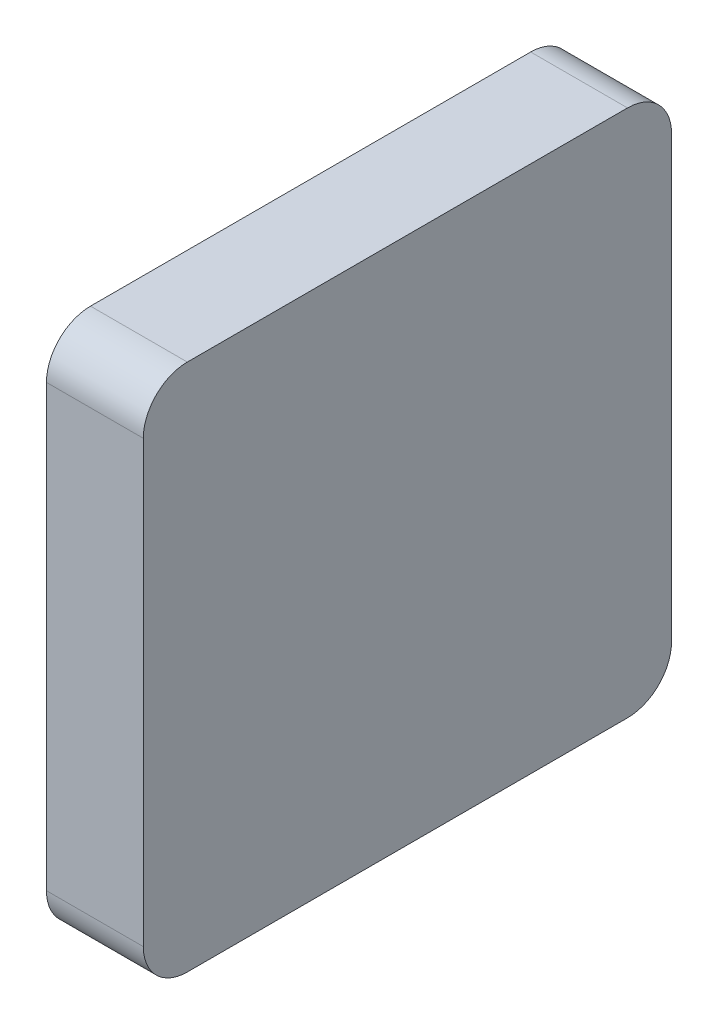
ISO-10303-21;
HEADER;
FILE_DESCRIPTION(('STEP AP214'),'2;1');
FILE_NAME('part.step','',(''),(''),'','','');
FILE_SCHEMA(('AUTOMOTIVE_DESIGN { 1 0 10303 214 1 1 1 1 }'));
ENDSEC;
DATA;
#1=APPLICATION_CONTEXT('core data for automotive mechanical design processes');
#2=APPLICATION_PROTOCOL_DEFINITION('international standard','automotive_design',2000,#1);
#3=PRODUCT_CONTEXT('',#1,'mechanical');
#4=PRODUCT('Part','Part','',(#3));
#5=PRODUCT_RELATED_PRODUCT_CATEGORY('part','',(#4));
#6=PRODUCT_DEFINITION_FORMATION('','',#4);
#7=PRODUCT_DEFINITION_CONTEXT('part definition',#1,'design');
#8=PRODUCT_DEFINITION('design','',#6,#7);
#9=PRODUCT_DEFINITION_SHAPE('','',#8);
#10=(LENGTH_UNIT() NAMED_UNIT(*) SI_UNIT(.MILLI.,.METRE.));
#11=(NAMED_UNIT(*) PLANE_ANGLE_UNIT() SI_UNIT($,.RADIAN.));
#12=(NAMED_UNIT(*) SI_UNIT($,.STERADIAN.) SOLID_ANGLE_UNIT());
#13=UNCERTAINTY_MEASURE_WITH_UNIT(LENGTH_MEASURE(1.E-05),#10,'distance_accuracy_value','');
#14=(GEOMETRIC_REPRESENTATION_CONTEXT(3) GLOBAL_UNCERTAINTY_ASSIGNED_CONTEXT((#13)) GLOBAL_UNIT_ASSIGNED_CONTEXT((#10,
#11,#12)) REPRESENTATION_CONTEXT('',''));
#15=CARTESIAN_POINT('',(0.,0.,0.));
#16=DIRECTION('',(0.,0.,1.));
#17=DIRECTION('',(1.,0.,0.));
#18=AXIS2_PLACEMENT_3D('',#15,#16,#17);
#19=CARTESIAN_POINT('',(22.,60.,60.));
#20=DIRECTION('',(0.,0.,-1.));
#21=DIRECTION('',(0.,1.,0.));
#22=AXIS2_PLACEMENT_3D('',#19,#20,#21);
#23=PLANE('',#22);
#24=DIRECTION('',(0.,-1.,0.));
#25=VECTOR('',#24,1.);
#26=CARTESIAN_POINT('',(0.,60.,60.));
#27=LINE('',#26,#25);
#28=CARTESIAN_POINT('',(0.,50.,60.));
#29=VERTEX_POINT('',#28);
#30=CARTESIAN_POINT('',(0.,-50.,60.));
#31=VERTEX_POINT('',#30);
#32=EDGE_CURVE('E148',#29,#31,#27,.T.);
#33=ORIENTED_EDGE('',*,*,#32,.T.);
#34=DIRECTION('',(-1.,0.,0.));
#35=VECTOR('',#34,1.);
#36=CARTESIAN_POINT('',(22.,-50.,60.));
#37=LINE('',#36,#35);
#38=CARTESIAN_POINT('',(22.,-50.,60.));
#39=VERTEX_POINT('',#38);
#40=EDGE_CURVE('E181',#31,#39,#37,.F.);
#41=ORIENTED_EDGE('',*,*,#40,.T.);
#42=DIRECTION('',(0.,-1.,0.));
#43=VECTOR('',#42,1.);
#44=CARTESIAN_POINT('',(22.,60.,60.));
#45=LINE('',#44,#43);
#46=CARTESIAN_POINT('',(22.,50.,60.));
#47=VERTEX_POINT('',#46);
#48=EDGE_CURVE('E146',#47,#39,#45,.T.);
#49=ORIENTED_EDGE('',*,*,#48,.F.);
#50=DIRECTION('',(-1.,0.,0.));
#51=VECTOR('',#50,1.);
#52=CARTESIAN_POINT('',(22.,50.,60.));
#53=LINE('',#52,#51);
#54=EDGE_CURVE('E177',#47,#29,#53,.T.);
#55=ORIENTED_EDGE('',*,*,#54,.T.);
#56=EDGE_LOOP('',(#33,#41,#49,#55));
#57=FACE_BOUND('',#56,.T.);
#58=ADVANCED_FACE('F45',(#57),#23,.F.);
#59=CARTESIAN_POINT('',(22.,-60.,60.));
#60=DIRECTION('',(0.,1.,0.));
#61=DIRECTION('',(0.,0.,1.));
#62=AXIS2_PLACEMENT_3D('',#59,#60,#61);
#63=PLANE('',#62);
#64=DIRECTION('',(0.,0.,-1.));
#65=VECTOR('',#64,1.);
#66=CARTESIAN_POINT('',(0.,-60.,60.));
#67=LINE('',#66,#65);
#68=CARTESIAN_POINT('',(0.,-60.,50.));
#69=VERTEX_POINT('',#68);
#70=CARTESIAN_POINT('',(0.,-60.,-50.));
#71=VERTEX_POINT('',#70);
#72=EDGE_CURVE('E142',#69,#71,#67,.T.);
#73=ORIENTED_EDGE('',*,*,#72,.T.);
#74=DIRECTION('',(-1.,0.,0.));
#75=VECTOR('',#74,1.);
#76=CARTESIAN_POINT('',(22.,-60.,-50.));
#77=LINE('',#76,#75);
#78=CARTESIAN_POINT('',(22.,-60.,-50.));
#79=VERTEX_POINT('',#78);
#80=EDGE_CURVE('E117',#71,#79,#77,.F.);
#81=ORIENTED_EDGE('',*,*,#80,.T.);
#82=DIRECTION('',(0.,0.,-1.));
#83=VECTOR('',#82,1.);
#84=CARTESIAN_POINT('',(22.,-60.,60.));
#85=LINE('',#84,#83);
#86=CARTESIAN_POINT('',(22.,-60.,50.));
#87=VERTEX_POINT('',#86);
#88=EDGE_CURVE('E188',#87,#79,#85,.T.);
#89=ORIENTED_EDGE('',*,*,#88,.F.);
#90=DIRECTION('',(-1.,0.,0.));
#91=VECTOR('',#90,1.);
#92=CARTESIAN_POINT('',(22.,-60.,50.));
#93=LINE('',#92,#91);
#94=EDGE_CURVE('E123',#87,#69,#93,.T.);
#95=ORIENTED_EDGE('',*,*,#94,.T.);
#96=EDGE_LOOP('',(#73,#81,#89,#95));
#97=FACE_BOUND('',#96,.T.);
#98=ADVANCED_FACE('F209',(#97),#63,.F.);
#99=CARTESIAN_POINT('',(22.,60.,-60.));
#100=DIRECTION('',(0.,0.,1.));
#101=DIRECTION('',(0.,-1.,0.));
#102=AXIS2_PLACEMENT_3D('',#99,#100,#101);
#103=PLANE('',#102);
#104=DIRECTION('',(0.,1.,0.));
#105=VECTOR('',#104,1.);
#106=CARTESIAN_POINT('',(22.,60.,-60.));
#107=LINE('',#106,#105);
#108=CARTESIAN_POINT('',(22.,-50.,-60.));
#109=VERTEX_POINT('',#108);
#110=CARTESIAN_POINT('',(22.,50.,-60.));
#111=VERTEX_POINT('',#110);
#112=EDGE_CURVE('E132',#109,#111,#107,.T.);
#113=ORIENTED_EDGE('',*,*,#112,.F.);
#114=DIRECTION('',(-1.,0.,0.));
#115=VECTOR('',#114,1.);
#116=CARTESIAN_POINT('',(22.,-50.,-60.));
#117=LINE('',#116,#115);
#118=CARTESIAN_POINT('',(0.,-50.,-60.));
#119=VERTEX_POINT('',#118);
#120=EDGE_CURVE('E116',#109,#119,#117,.T.);
#121=ORIENTED_EDGE('',*,*,#120,.T.);
#122=DIRECTION('',(0.,1.,0.));
#123=VECTOR('',#122,1.);
#124=CARTESIAN_POINT('',(0.,60.,-60.));
#125=LINE('',#124,#123);
#126=CARTESIAN_POINT('',(0.,50.,-60.));
#127=VERTEX_POINT('',#126);
#128=EDGE_CURVE('E130',#119,#127,#125,.T.);
#129=ORIENTED_EDGE('',*,*,#128,.T.);
#130=DIRECTION('',(-1.,0.,0.));
#131=VECTOR('',#130,1.);
#132=CARTESIAN_POINT('',(22.,50.,-60.));
#133=LINE('',#132,#131);
#134=EDGE_CURVE('E135',#127,#111,#133,.F.);
#135=ORIENTED_EDGE('',*,*,#134,.T.);
#136=EDGE_LOOP('',(#113,#121,#129,#135));
#137=FACE_BOUND('',#136,.T.);
#138=ADVANCED_FACE('F129',(#137),#103,.F.);
#139=CARTESIAN_POINT('',(22.,60.,60.));
#140=DIRECTION('',(0.,-1.,0.));
#141=DIRECTION('',(0.,0.,-1.));
#142=AXIS2_PLACEMENT_3D('',#139,#140,#141);
#143=PLANE('',#142);
#144=DIRECTION('',(0.,0.,1.));
#145=VECTOR('',#144,1.);
#146=CARTESIAN_POINT('',(22.,60.,60.));
#147=LINE('',#146,#145);
#148=CARTESIAN_POINT('',(22.,60.,-50.));
#149=VERTEX_POINT('',#148);
#150=CARTESIAN_POINT('',(22.,60.,50.));
#151=VERTEX_POINT('',#150);
#152=EDGE_CURVE('E153',#149,#151,#147,.T.);
#153=ORIENTED_EDGE('',*,*,#152,.F.);
#154=DIRECTION('',(-1.,0.,0.));
#155=VECTOR('',#154,1.);
#156=CARTESIAN_POINT('',(22.,60.,-50.));
#157=LINE('',#156,#155);
#158=CARTESIAN_POINT('',(0.,60.,-50.));
#159=VERTEX_POINT('',#158);
#160=EDGE_CURVE('E11',#149,#159,#157,.T.);
#161=ORIENTED_EDGE('',*,*,#160,.T.);
#162=DIRECTION('',(0.,0.,1.));
#163=VECTOR('',#162,1.);
#164=CARTESIAN_POINT('',(0.,60.,60.));
#165=LINE('',#164,#163);
#166=CARTESIAN_POINT('',(0.,60.,50.));
#167=VERTEX_POINT('',#166);
#168=EDGE_CURVE('E141',#159,#167,#165,.T.);
#169=ORIENTED_EDGE('',*,*,#168,.T.);
#170=DIRECTION('',(-1.,0.,0.));
#171=VECTOR('',#170,1.);
#172=CARTESIAN_POINT('',(22.,60.,50.));
#173=LINE('',#172,#171);
#174=EDGE_CURVE('E54',#167,#151,#173,.F.);
#175=ORIENTED_EDGE('',*,*,#174,.T.);
#176=EDGE_LOOP('',(#153,#161,#169,#175));
#177=FACE_BOUND('',#176,.T.);
#178=ADVANCED_FACE('F216',(#177),#143,.F.);
#179=CARTESIAN_POINT('',(22.,0.,0.));
#180=DIRECTION('',(1.,0.,0.));
#181=DIRECTION('',(0.,0.,-1.));
#182=AXIS2_PLACEMENT_3D('',#179,#180,#181);
#183=PLANE('',#182);
#184=ORIENTED_EDGE('',*,*,#88,.T.);
#185=CARTESIAN_POINT('',(22.,-50.,-50.));
#186=DIRECTION('',(1.,0.,0.));
#187=DIRECTION('',(0.,0.,-1.));
#188=AXIS2_PLACEMENT_3D('',#185,#186,#187);
#189=CIRCLE('',#188,10.);
#190=EDGE_CURVE('E174',#79,#109,#189,.T.);
#191=ORIENTED_EDGE('',*,*,#190,.T.);
#192=ORIENTED_EDGE('',*,*,#112,.T.);
#193=CARTESIAN_POINT('',(22.,50.,-50.));
#194=DIRECTION('',(1.,0.,0.));
#195=DIRECTION('',(0.,0.,-1.));
#196=AXIS2_PLACEMENT_3D('',#193,#194,#195);
#197=CIRCLE('',#196,10.);
#198=EDGE_CURVE('E67',#111,#149,#197,.T.);
#199=ORIENTED_EDGE('',*,*,#198,.T.);
#200=ORIENTED_EDGE('',*,*,#152,.T.);
#201=CARTESIAN_POINT('',(22.,50.,50.));
#202=DIRECTION('',(1.,0.,0.));
#203=DIRECTION('',(0.,0.,-1.));
#204=AXIS2_PLACEMENT_3D('',#201,#202,#203);
#205=CIRCLE('',#204,10.);
#206=EDGE_CURVE('E166',#151,#47,#205,.T.);
#207=ORIENTED_EDGE('',*,*,#206,.T.);
#208=ORIENTED_EDGE('',*,*,#48,.T.);
#209=CARTESIAN_POINT('',(22.,-50.,50.));
#210=DIRECTION('',(1.,0.,0.));
#211=DIRECTION('',(0.,0.,-1.));
#212=AXIS2_PLACEMENT_3D('',#209,#210,#211);
#213=CIRCLE('',#212,10.);
#214=EDGE_CURVE('E171',#39,#87,#213,.T.);
#215=ORIENTED_EDGE('',*,*,#214,.T.);
#216=EDGE_LOOP('',(#184,#191,#192,#199,#200,#207,#208,#215));
#217=FACE_BOUND('',#216,.T.);
#218=ADVANCED_FACE('F207',(#217),#183,.T.);
#219=CARTESIAN_POINT('',(0.,0.,0.));
#220=DIRECTION('',(1.,0.,0.));
#221=DIRECTION('',(0.,0.,-1.));
#222=AXIS2_PLACEMENT_3D('',#219,#220,#221);
#223=PLANE('',#222);
#224=ORIENTED_EDGE('',*,*,#128,.F.);
#225=CARTESIAN_POINT('',(0.,-50.,-50.));
#226=DIRECTION('',(1.,0.,0.));
#227=DIRECTION('',(0.,0.,-1.));
#228=AXIS2_PLACEMENT_3D('',#225,#226,#227);
#229=CIRCLE('',#228,10.);
#230=EDGE_CURVE('E112',#119,#71,#229,.F.);
#231=ORIENTED_EDGE('',*,*,#230,.T.);
#232=ORIENTED_EDGE('',*,*,#72,.F.);
#233=CARTESIAN_POINT('',(0.,-50.,50.));
#234=DIRECTION('',(1.,0.,0.));
#235=DIRECTION('',(0.,0.,-1.));
#236=AXIS2_PLACEMENT_3D('',#233,#234,#235);
#237=CIRCLE('',#236,10.);
#238=EDGE_CURVE('E124',#69,#31,#237,.F.);
#239=ORIENTED_EDGE('',*,*,#238,.T.);
#240=ORIENTED_EDGE('',*,*,#32,.F.);
#241=CARTESIAN_POINT('',(0.,50.,50.));
#242=DIRECTION('',(1.,0.,0.));
#243=DIRECTION('',(0.,0.,-1.));
#244=AXIS2_PLACEMENT_3D('',#241,#242,#243);
#245=CIRCLE('',#244,10.);
#246=EDGE_CURVE('E134',#29,#167,#245,.F.);
#247=ORIENTED_EDGE('',*,*,#246,.T.);
#248=ORIENTED_EDGE('',*,*,#168,.F.);
#249=CARTESIAN_POINT('',(0.,50.,-50.));
#250=DIRECTION('',(1.,0.,0.));
#251=DIRECTION('',(0.,0.,-1.));
#252=AXIS2_PLACEMENT_3D('',#249,#250,#251);
#253=CIRCLE('',#252,10.);
#254=EDGE_CURVE('E139',#159,#127,#253,.F.);
#255=ORIENTED_EDGE('',*,*,#254,.T.);
#256=EDGE_LOOP('',(#224,#231,#232,#239,#240,#247,#248,#255));
#257=FACE_BOUND('',#256,.T.);
#258=ADVANCED_FACE('F137',(#257),#223,.F.);
#259=CARTESIAN_POINT('',(22.,-50.,-50.));
#260=DIRECTION('',(-1.,0.,0.));
#261=DIRECTION('',(0.,0.,1.));
#262=AXIS2_PLACEMENT_3D('',#259,#260,#261);
#263=CYLINDRICAL_SURFACE('',#262,10.);
#264=ORIENTED_EDGE('',*,*,#190,.F.);
#265=ORIENTED_EDGE('',*,*,#80,.F.);
#266=ORIENTED_EDGE('',*,*,#230,.F.);
#267=ORIENTED_EDGE('',*,*,#120,.F.);
#268=EDGE_LOOP('',(#264,#265,#266,#267));
#269=FACE_BOUND('',#268,.T.);
#270=ADVANCED_FACE('F115',(#269),#263,.T.);
#271=CARTESIAN_POINT('',(22.,-50.,50.));
#272=DIRECTION('',(-1.,0.,0.));
#273=DIRECTION('',(0.,0.,1.));
#274=AXIS2_PLACEMENT_3D('',#271,#272,#273);
#275=CYLINDRICAL_SURFACE('',#274,10.);
#276=ORIENTED_EDGE('',*,*,#214,.F.);
#277=ORIENTED_EDGE('',*,*,#40,.F.);
#278=ORIENTED_EDGE('',*,*,#238,.F.);
#279=ORIENTED_EDGE('',*,*,#94,.F.);
#280=EDGE_LOOP('',(#276,#277,#278,#279));
#281=FACE_BOUND('',#280,.T.);
#282=ADVANCED_FACE('F204',(#281),#275,.T.);
#283=CARTESIAN_POINT('',(22.,50.,-50.));
#284=DIRECTION('',(-1.,0.,0.));
#285=DIRECTION('',(0.,0.,1.));
#286=AXIS2_PLACEMENT_3D('',#283,#284,#285);
#287=CYLINDRICAL_SURFACE('',#286,10.);
#288=ORIENTED_EDGE('',*,*,#198,.F.);
#289=ORIENTED_EDGE('',*,*,#134,.F.);
#290=ORIENTED_EDGE('',*,*,#254,.F.);
#291=ORIENTED_EDGE('',*,*,#160,.F.);
#292=EDGE_LOOP('',(#288,#289,#290,#291));
#293=FACE_BOUND('',#292,.T.);
#294=ADVANCED_FACE('F224',(#293),#287,.T.);
#295=CARTESIAN_POINT('',(22.,50.,50.));
#296=DIRECTION('',(-1.,0.,0.));
#297=DIRECTION('',(0.,0.,1.));
#298=AXIS2_PLACEMENT_3D('',#295,#296,#297);
#299=CYLINDRICAL_SURFACE('',#298,10.);
#300=ORIENTED_EDGE('',*,*,#206,.F.);
#301=ORIENTED_EDGE('',*,*,#174,.F.);
#302=ORIENTED_EDGE('',*,*,#246,.F.);
#303=ORIENTED_EDGE('',*,*,#54,.F.);
#304=EDGE_LOOP('',(#300,#301,#302,#303));
#305=FACE_BOUND('',#304,.T.);
#306=ADVANCED_FACE('F47',(#305),#299,.T.);
#307=CLOSED_SHELL('',(#58,#98,#138,#178,#218,#258,#270,#282,#294,#306));
#308=MANIFOLD_SOLID_BREP('B2',#307);
#309=ADVANCED_BREP_SHAPE_REPRESENTATION('',(#18,#308),#14);
#310=SHAPE_DEFINITION_REPRESENTATION(#9,#309);
ENDSEC;
END-ISO-10303-21;
